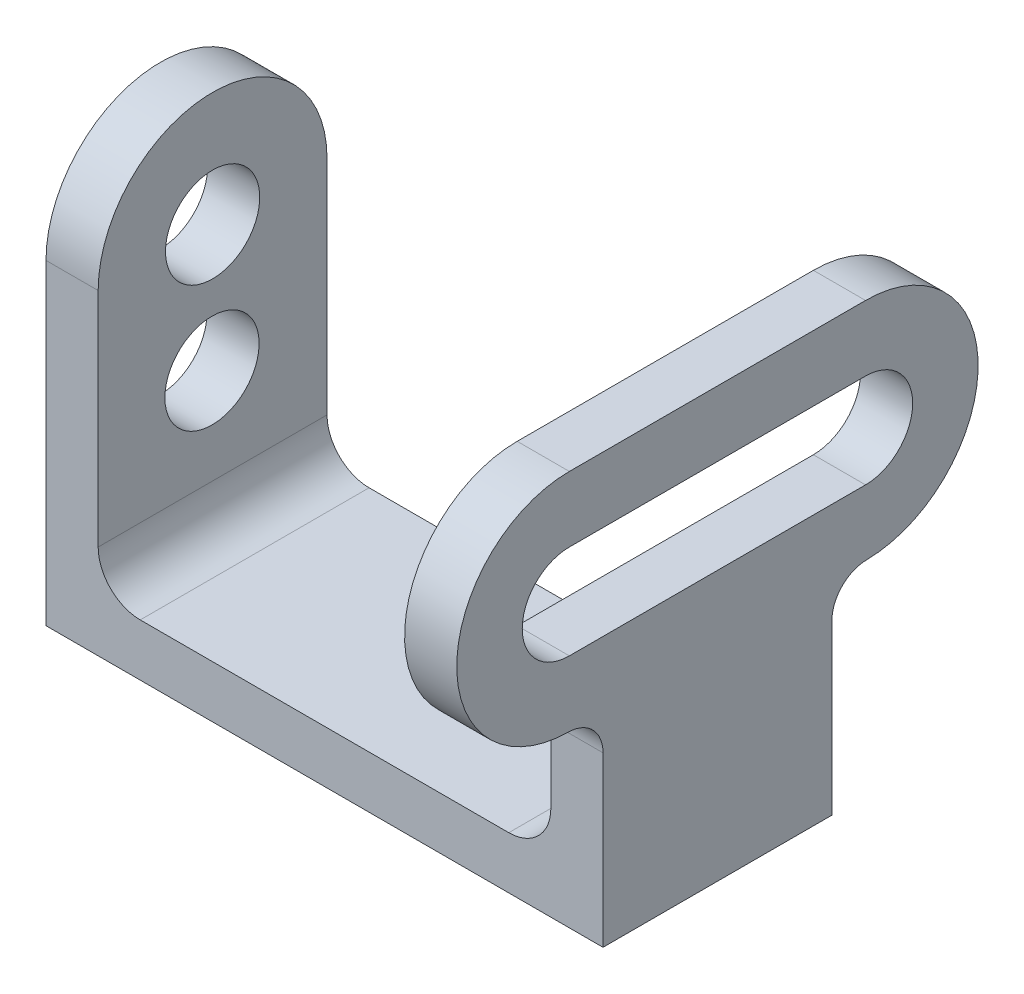
ISO-10303-21;
HEADER;
FILE_DESCRIPTION(('STEP AP214'),'2;1');
FILE_NAME('part.step','',(''),(''),'','','');
FILE_SCHEMA(('AUTOMOTIVE_DESIGN { 1 0 10303 214 1 1 1 1 }'));
ENDSEC;
DATA;
#1=APPLICATION_CONTEXT('core data for automotive mechanical design processes');
#2=APPLICATION_PROTOCOL_DEFINITION('international standard','automotive_design',2000,#1);
#3=PRODUCT_CONTEXT('',#1,'mechanical');
#4=PRODUCT('Part','Part','',(#3));
#5=PRODUCT_RELATED_PRODUCT_CATEGORY('part','',(#4));
#6=PRODUCT_DEFINITION_FORMATION('','',#4);
#7=PRODUCT_DEFINITION_CONTEXT('part definition',#1,'design');
#8=PRODUCT_DEFINITION('design','',#6,#7);
#9=PRODUCT_DEFINITION_SHAPE('','',#8);
#10=(LENGTH_UNIT() NAMED_UNIT(*) SI_UNIT(.MILLI.,.METRE.));
#11=(NAMED_UNIT(*) PLANE_ANGLE_UNIT() SI_UNIT($,.RADIAN.));
#12=(NAMED_UNIT(*) SI_UNIT($,.STERADIAN.) SOLID_ANGLE_UNIT());
#13=UNCERTAINTY_MEASURE_WITH_UNIT(LENGTH_MEASURE(1.E-05),#10,'distance_accuracy_value','');
#14=(GEOMETRIC_REPRESENTATION_CONTEXT(3) GLOBAL_UNCERTAINTY_ASSIGNED_CONTEXT((#13)) GLOBAL_UNIT_ASSIGNED_CONTEXT((#10,
#11,#12)) REPRESENTATION_CONTEXT('',''));
#15=CARTESIAN_POINT('',(0.,0.,0.));
#16=DIRECTION('',(0.,0.,1.));
#17=DIRECTION('',(1.,0.,0.));
#18=AXIS2_PLACEMENT_3D('',#15,#16,#17);
#19=CARTESIAN_POINT('',(0.,0.,-34.544));
#20=DIRECTION('',(0.,0.,-1.));
#21=DIRECTION('',(-1.,0.,0.));
#22=AXIS2_PLACEMENT_3D('',#19,#20,#21);
#23=PLANE('',#22);
#24=DIRECTION('',(0.,-1.,0.));
#25=VECTOR('',#24,1.);
#26=CARTESIAN_POINT('',(9.97764102564103,-5.94840199309171,-34.544));
#27=LINE('',#26,#25);
#28=CARTESIAN_POINT('',(9.97764102564103,11.6023960478304,-34.544));
#29=VERTEX_POINT('',#28);
#30=CARTESIAN_POINT('',(9.97764102564103,0.401598006908288,-34.544));
#31=VERTEX_POINT('',#30);
#32=EDGE_CURVE('E255',#29,#31,#27,.T.);
#33=ORIENTED_EDGE('',*,*,#32,.F.);
#34=DIRECTION('',(1.,0.,0.));
#35=VECTOR('',#34,1.);
#36=CARTESIAN_POINT('',(-77.9930484507027,11.6023960478304,-34.544));
#37=LINE('',#36,#35);
#38=CARTESIAN_POINT('',(17.851641025641,11.6023960478304,-34.544));
#39=VERTEX_POINT('',#38);
#40=EDGE_CURVE('E223',#29,#39,#37,.T.);
#41=ORIENTED_EDGE('',*,*,#40,.T.);
#42=DIRECTION('',(0.,1.,0.));
#43=VECTOR('',#42,1.);
#44=CARTESIAN_POINT('',(17.851641025641,33.9295980069083,-34.544));
#45=LINE('',#44,#43);
#46=CARTESIAN_POINT('',(17.851641025641,-13.8224019930917,-34.544));
#47=VERTEX_POINT('',#46);
#48=EDGE_CURVE('E252',#47,#39,#45,.T.);
#49=ORIENTED_EDGE('',*,*,#48,.F.);
#50=DIRECTION('',(1.,0.,0.));
#51=VECTOR('',#50,1.);
#52=CARTESIAN_POINT('',(17.851641025641,-13.8224019930917,-34.544));
#53=LINE('',#52,#51);
#54=CARTESIAN_POINT('',(-66.222358974359,-13.8224019930917,-34.544));
#55=VERTEX_POINT('',#54);
#56=EDGE_CURVE('E248',#55,#47,#53,.T.);
#57=ORIENTED_EDGE('',*,*,#56,.F.);
#58=DIRECTION('',(0.,-1.,0.));
#59=VECTOR('',#58,1.);
#60=CARTESIAN_POINT('',(-66.222358974359,-13.8224019930917,-34.544));
#61=LINE('',#60,#59);
#62=CARTESIAN_POINT('',(-66.222358974359,33.9295980069083,-34.544));
#63=VERTEX_POINT('',#62);
#64=EDGE_CURVE('E245',#63,#55,#61,.T.);
#65=ORIENTED_EDGE('',*,*,#64,.F.);
#66=DIRECTION('',(-1.,0.,0.));
#67=VECTOR('',#66,1.);
#68=CARTESIAN_POINT('',(-66.222358974359,33.9295980069083,-34.544));
#69=LINE('',#68,#67);
#70=CARTESIAN_POINT('',(-58.348358974359,33.9295980069083,-34.544));
#71=VERTEX_POINT('',#70);
#72=EDGE_CURVE('E263',#71,#63,#69,.T.);
#73=ORIENTED_EDGE('',*,*,#72,.F.);
#74=DIRECTION('',(0.,1.,0.));
#75=VECTOR('',#74,1.);
#76=CARTESIAN_POINT('',(-58.348358974359,33.9295980069083,-34.544));
#77=LINE('',#76,#75);
#78=CARTESIAN_POINT('',(-58.348358974359,0.401598006908289,-34.544));
#79=VERTEX_POINT('',#78);
#80=EDGE_CURVE('E261',#79,#71,#77,.T.);
#81=ORIENTED_EDGE('',*,*,#80,.F.);
#82=CARTESIAN_POINT('',(-51.998358974359,0.401598006908288,-34.544));
#83=DIRECTION('',(0.,0.,-1.));
#84=DIRECTION('',(-1.,0.,0.));
#85=AXIS2_PLACEMENT_3D('',#82,#83,#84);
#86=CIRCLE('',#85,6.35);
#87=CARTESIAN_POINT('',(-51.998358974359,-5.94840199309171,-34.544));
#88=VERTEX_POINT('',#87);
#89=EDGE_CURVE('E11',#79,#88,#86,.F.);
#90=ORIENTED_EDGE('',*,*,#89,.T.);
#91=DIRECTION('',(-1.,0.,0.));
#92=VECTOR('',#91,1.);
#93=CARTESIAN_POINT('',(-58.348358974359,-5.94840199309171,-34.544));
#94=LINE('',#93,#92);
#95=CARTESIAN_POINT('',(3.62764102564102,-5.94840199309171,-34.544));
#96=VERTEX_POINT('',#95);
#97=EDGE_CURVE('E258',#96,#88,#94,.T.);
#98=ORIENTED_EDGE('',*,*,#97,.F.);
#99=CARTESIAN_POINT('',(3.62764102564103,0.401598006908288,-34.544));
#100=DIRECTION('',(0.,0.,-1.));
#101=DIRECTION('',(-1.,0.,0.));
#102=AXIS2_PLACEMENT_3D('',#99,#100,#101);
#103=CIRCLE('',#102,6.35);
#104=EDGE_CURVE('E296',#96,#31,#103,.F.);
#105=ORIENTED_EDGE('',*,*,#104,.T.);
#106=EDGE_LOOP('',(#33,#41,#49,#57,#65,#73,#81,#90,#98,#105));
#107=FACE_BOUND('',#106,.T.);
#108=ADVANCED_FACE('F35',(#107),#23,.T.);
#109=CARTESIAN_POINT('',(0.,0.,0.));
#110=DIRECTION('',(0.,0.,-1.));
#111=DIRECTION('',(-1.,0.,0.));
#112=AXIS2_PLACEMENT_3D('',#109,#110,#111);
#113=PLANE('',#112);
#114=DIRECTION('',(1.,0.,0.));
#115=VECTOR('',#114,1.);
#116=CARTESIAN_POINT('',(-77.9930484507027,11.6023960478304,0.));
#117=LINE('',#116,#115);
#118=CARTESIAN_POINT('',(9.97764102564103,11.6023960478304,0.));
#119=VERTEX_POINT('',#118);
#120=CARTESIAN_POINT('',(17.851641025641,11.6023960478304,0.));
#121=VERTEX_POINT('',#120);
#122=EDGE_CURVE('E213',#119,#121,#117,.T.);
#123=ORIENTED_EDGE('',*,*,#122,.F.);
#124=DIRECTION('',(0.,-1.,0.));
#125=VECTOR('',#124,1.);
#126=CARTESIAN_POINT('',(9.97764102564103,-5.94840199309171,0.));
#127=LINE('',#126,#125);
#128=CARTESIAN_POINT('',(9.97764102564103,0.401598006908288,0.));
#129=VERTEX_POINT('',#128);
#130=EDGE_CURVE('E273',#119,#129,#127,.T.);
#131=ORIENTED_EDGE('',*,*,#130,.T.);
#132=CARTESIAN_POINT('',(3.62764102564103,0.401598006908288,0.));
#133=DIRECTION('',(0.,0.,-1.));
#134=DIRECTION('',(-1.,0.,0.));
#135=AXIS2_PLACEMENT_3D('',#132,#133,#134);
#136=CIRCLE('',#135,6.35);
#137=CARTESIAN_POINT('',(3.62764102564102,-5.94840199309171,0.));
#138=VERTEX_POINT('',#137);
#139=EDGE_CURVE('E294',#129,#138,#136,.T.);
#140=ORIENTED_EDGE('',*,*,#139,.T.);
#141=DIRECTION('',(-1.,0.,0.));
#142=VECTOR('',#141,1.);
#143=CARTESIAN_POINT('',(-58.348358974359,-5.94840199309171,0.));
#144=LINE('',#143,#142);
#145=CARTESIAN_POINT('',(-51.998358974359,-5.94840199309171,0.));
#146=VERTEX_POINT('',#145);
#147=EDGE_CURVE('E276',#138,#146,#144,.T.);
#148=ORIENTED_EDGE('',*,*,#147,.T.);
#149=CARTESIAN_POINT('',(-51.998358974359,0.401598006908288,0.));
#150=DIRECTION('',(0.,0.,-1.));
#151=DIRECTION('',(-1.,0.,0.));
#152=AXIS2_PLACEMENT_3D('',#149,#150,#151);
#153=CIRCLE('',#152,6.35);
#154=CARTESIAN_POINT('',(-58.348358974359,0.401598006908289,0.));
#155=VERTEX_POINT('',#154);
#156=EDGE_CURVE('E43',#146,#155,#153,.T.);
#157=ORIENTED_EDGE('',*,*,#156,.T.);
#158=DIRECTION('',(0.,1.,0.));
#159=VECTOR('',#158,1.);
#160=CARTESIAN_POINT('',(-58.348358974359,33.9295980069083,0.));
#161=LINE('',#160,#159);
#162=CARTESIAN_POINT('',(-58.348358974359,33.9295980069083,0.));
#163=VERTEX_POINT('',#162);
#164=EDGE_CURVE('E278',#155,#163,#161,.T.);
#165=ORIENTED_EDGE('',*,*,#164,.T.);
#166=DIRECTION('',(-1.,0.,0.));
#167=VECTOR('',#166,1.);
#168=CARTESIAN_POINT('',(-66.222358974359,33.9295980069083,0.));
#169=LINE('',#168,#167);
#170=CARTESIAN_POINT('',(-66.222358974359,33.9295980069083,0.));
#171=VERTEX_POINT('',#170);
#172=EDGE_CURVE('E249',#163,#171,#169,.T.);
#173=ORIENTED_EDGE('',*,*,#172,.T.);
#174=DIRECTION('',(0.,-1.,0.));
#175=VECTOR('',#174,1.);
#176=CARTESIAN_POINT('',(-66.222358974359,-13.8224019930917,0.));
#177=LINE('',#176,#175);
#178=CARTESIAN_POINT('',(-66.222358974359,-13.8224019930917,0.));
#179=VERTEX_POINT('',#178);
#180=EDGE_CURVE('E240',#171,#179,#177,.T.);
#181=ORIENTED_EDGE('',*,*,#180,.T.);
#182=DIRECTION('',(1.,0.,0.));
#183=VECTOR('',#182,1.);
#184=CARTESIAN_POINT('',(17.851641025641,-13.8224019930917,0.));
#185=LINE('',#184,#183);
#186=CARTESIAN_POINT('',(17.851641025641,-13.8224019930917,0.));
#187=VERTEX_POINT('',#186);
#188=EDGE_CURVE('E268',#179,#187,#185,.T.);
#189=ORIENTED_EDGE('',*,*,#188,.T.);
#190=DIRECTION('',(0.,1.,0.));
#191=VECTOR('',#190,1.);
#192=CARTESIAN_POINT('',(17.851641025641,33.9295980069083,0.));
#193=LINE('',#192,#191);
#194=EDGE_CURVE('E271',#187,#121,#193,.T.);
#195=ORIENTED_EDGE('',*,*,#194,.T.);
#196=EDGE_LOOP('',(#123,#131,#140,#148,#157,#165,#173,#181,#189,#195));
#197=FACE_BOUND('',#196,.T.);
#198=ADVANCED_FACE('F309',(#197),#113,.F.);
#199=CARTESIAN_POINT('',(-66.222358974359,-13.8224019930917,-34.544));
#200=DIRECTION('',(-1.,0.,0.));
#201=DIRECTION('',(0.,0.,1.));
#202=AXIS2_PLACEMENT_3D('',#199,#200,#201);
#203=PLANE('',#202);
#204=CARTESIAN_POINT('',(-66.222358974359,33.9295980069083,-17.272));
#205=DIRECTION('',(-1.,0.,0.));
#206=DIRECTION('',(0.,0.,1.));
#207=AXIS2_PLACEMENT_3D('',#204,#205,#206);
#208=CIRCLE('',#207,7.112);
#209=CARTESIAN_POINT('',(-66.222358974359,33.9295980069083,-10.16));
#210=VERTEX_POINT('',#209);
#211=EDGE_CURVE('E233',#210,#210,#208,.T.);
#212=ORIENTED_EDGE('',*,*,#211,.F.);
#213=EDGE_LOOP('',(#212));
#214=FACE_BOUND('',#213,.T.);
#215=CARTESIAN_POINT('',(-66.222358974359,33.9295980069083,-17.272));
#216=DIRECTION('',(-1.,0.,0.));
#217=DIRECTION('',(0.,0.,1.));
#218=AXIS2_PLACEMENT_3D('',#215,#216,#217);
#219=CIRCLE('',#218,17.272);
#220=EDGE_CURVE('E188',#171,#63,#219,.T.);
#221=ORIENTED_EDGE('',*,*,#220,.T.);
#222=ORIENTED_EDGE('',*,*,#64,.T.);
#223=DIRECTION('',(0.,0.,1.));
#224=VECTOR('',#223,1.);
#225=CARTESIAN_POINT('',(-66.222358974359,-13.8224019930917,-34.544));
#226=LINE('',#225,#224);
#227=EDGE_CURVE('E265',#55,#179,#226,.T.);
#228=ORIENTED_EDGE('',*,*,#227,.T.);
#229=ORIENTED_EDGE('',*,*,#180,.F.);
#230=EDGE_LOOP('',(#221,#222,#228,#229));
#231=FACE_BOUND('',#230,.T.);
#232=CARTESIAN_POINT('',(-66.222358974359,14.8795980069083,-17.181485908189));
#233=DIRECTION('',(-1.,0.,0.));
#234=DIRECTION('',(0.,0.,1.));
#235=AXIS2_PLACEMENT_3D('',#232,#233,#234);
#236=CIRCLE('',#235,7.112);
#237=CARTESIAN_POINT('',(-66.222358974359,14.8795980069083,-10.069485908189));
#238=VERTEX_POINT('',#237);
#239=EDGE_CURVE('E231',#238,#238,#236,.T.);
#240=ORIENTED_EDGE('',*,*,#239,.F.);
#241=EDGE_LOOP('',(#240));
#242=FACE_BOUND('',#241,.T.);
#243=ADVANCED_FACE('F326',(#214,#231,#242),#203,.T.);
#244=CARTESIAN_POINT('',(-58.348358974359,33.9295980069083,-34.544));
#245=DIRECTION('',(1.,0.,0.));
#246=DIRECTION('',(0.,1.,0.));
#247=AXIS2_PLACEMENT_3D('',#244,#245,#246);
#248=PLANE('',#247);
#249=CARTESIAN_POINT('',(-58.348358974359,33.9295980069083,-17.272));
#250=DIRECTION('',(1.,0.,0.));
#251=DIRECTION('',(0.,1.,0.));
#252=AXIS2_PLACEMENT_3D('',#249,#250,#251);
#253=CIRCLE('',#252,7.112);
#254=CARTESIAN_POINT('',(-58.348358974359,41.0415980069083,-17.272));
#255=VERTEX_POINT('',#254);
#256=EDGE_CURVE('E236',#255,#255,#253,.F.);
#257=ORIENTED_EDGE('',*,*,#256,.T.);
#258=EDGE_LOOP('',(#257));
#259=FACE_BOUND('',#258,.T.);
#260=ORIENTED_EDGE('',*,*,#164,.F.);
#261=DIRECTION('',(0.,0.,1.));
#262=VECTOR('',#261,1.);
#263=CARTESIAN_POINT('',(-58.348358974359,0.401598006908287,-34.544));
#264=LINE('',#263,#262);
#265=EDGE_CURVE('E56',#155,#79,#264,.F.);
#266=ORIENTED_EDGE('',*,*,#265,.T.);
#267=ORIENTED_EDGE('',*,*,#80,.T.);
#268=CARTESIAN_POINT('',(-58.348358974359,33.9295980069083,-17.272));
#269=DIRECTION('',(1.,0.,0.));
#270=DIRECTION('',(0.,1.,0.));
#271=AXIS2_PLACEMENT_3D('',#268,#269,#270);
#272=CIRCLE('',#271,17.272);
#273=EDGE_CURVE('E184',#163,#71,#272,.F.);
#274=ORIENTED_EDGE('',*,*,#273,.F.);
#275=EDGE_LOOP('',(#260,#266,#267,#274));
#276=FACE_BOUND('',#275,.T.);
#277=CARTESIAN_POINT('',(-58.348358974359,14.8795980069083,-17.181485908189));
#278=DIRECTION('',(1.,0.,0.));
#279=DIRECTION('',(0.,1.,0.));
#280=AXIS2_PLACEMENT_3D('',#277,#278,#279);
#281=CIRCLE('',#280,7.112);
#282=CARTESIAN_POINT('',(-58.348358974359,21.9915980069083,-17.181485908189));
#283=VERTEX_POINT('',#282);
#284=EDGE_CURVE('E237',#283,#283,#281,.F.);
#285=ORIENTED_EDGE('',*,*,#284,.T.);
#286=EDGE_LOOP('',(#285));
#287=FACE_BOUND('',#286,.T.);
#288=ADVANCED_FACE('F318',(#259,#276,#287),#248,.T.);
#289=CARTESIAN_POINT('',(-58.348358974359,-5.94840199309171,-34.544));
#290=DIRECTION('',(0.,1.,0.));
#291=DIRECTION('',(0.,0.,1.));
#292=AXIS2_PLACEMENT_3D('',#289,#290,#291);
#293=PLANE('',#292);
#294=ORIENTED_EDGE('',*,*,#147,.F.);
#295=DIRECTION('',(0.,0.,1.));
#296=VECTOR('',#295,1.);
#297=CARTESIAN_POINT('',(3.62764102564103,-5.94840199309171,-34.544));
#298=LINE('',#297,#296);
#299=EDGE_CURVE('E291',#138,#96,#298,.F.);
#300=ORIENTED_EDGE('',*,*,#299,.T.);
#301=ORIENTED_EDGE('',*,*,#97,.T.);
#302=DIRECTION('',(0.,0.,1.));
#303=VECTOR('',#302,1.);
#304=CARTESIAN_POINT('',(-51.998358974359,-5.94840199309171,0.));
#305=LINE('',#304,#303);
#306=EDGE_CURVE('E288',#88,#146,#305,.T.);
#307=ORIENTED_EDGE('',*,*,#306,.T.);
#308=EDGE_LOOP('',(#294,#300,#301,#307));
#309=FACE_BOUND('',#308,.T.);
#310=ADVANCED_FACE('F311',(#309),#293,.T.);
#311=CARTESIAN_POINT('',(9.97764102564103,-5.94840199309171,-34.544));
#312=DIRECTION('',(-1.,0.,0.));
#313=DIRECTION('',(0.,0.,1.));
#314=AXIS2_PLACEMENT_3D('',#311,#312,#313);
#315=PLANE('',#314);
#316=DIRECTION('',(0.,0.,-1.));
#317=VECTOR('',#316,1.);
#318=CARTESIAN_POINT('',(9.97764102564103,26.8175980069083,0.));
#319=LINE('',#318,#317);
#320=CARTESIAN_POINT('',(9.97764102564103,26.8175980069083,5.08));
#321=VERTEX_POINT('',#320);
#322=CARTESIAN_POINT('',(9.97764102564103,26.8175980069083,-39.624));
#323=VERTEX_POINT('',#322);
#324=EDGE_CURVE('E171',#321,#323,#319,.T.);
#325=ORIENTED_EDGE('',*,*,#324,.T.);
#326=CARTESIAN_POINT('',(9.97764102564103,33.9295980069083,-39.624));
#327=DIRECTION('',(-1.,0.,0.));
#328=DIRECTION('',(0.,0.,1.));
#329=AXIS2_PLACEMENT_3D('',#326,#327,#328);
#330=CIRCLE('',#329,7.112);
#331=CARTESIAN_POINT('',(9.97764102564103,41.0415980069083,-39.624));
#332=VERTEX_POINT('',#331);
#333=EDGE_CURVE('E185',#323,#332,#330,.F.);
#334=ORIENTED_EDGE('',*,*,#333,.T.);
#335=DIRECTION('',(0.,0.,-1.));
#336=VECTOR('',#335,1.);
#337=CARTESIAN_POINT('',(9.97764102564103,41.0415980069083,0.));
#338=LINE('',#337,#336);
#339=CARTESIAN_POINT('',(9.97764102564103,41.0415980069083,5.08));
#340=VERTEX_POINT('',#339);
#341=EDGE_CURVE('E183',#340,#332,#338,.T.);
#342=ORIENTED_EDGE('',*,*,#341,.F.);
#343=CARTESIAN_POINT('',(9.97764102564103,33.9295980069083,5.08));
#344=DIRECTION('',(-1.,0.,0.));
#345=DIRECTION('',(0.,0.,1.));
#346=AXIS2_PLACEMENT_3D('',#343,#344,#345);
#347=CIRCLE('',#346,7.112);
#348=EDGE_CURVE('E162',#340,#321,#347,.F.);
#349=ORIENTED_EDGE('',*,*,#348,.T.);
#350=EDGE_LOOP('',(#325,#334,#342,#349));
#351=FACE_BOUND('',#350,.T.);
#352=ORIENTED_EDGE('',*,*,#32,.T.);
#353=DIRECTION('',(0.,0.,1.));
#354=VECTOR('',#353,1.);
#355=CARTESIAN_POINT('',(9.97764102564103,0.401598006908288,0.));
#356=LINE('',#355,#354);
#357=EDGE_CURVE('E284',#31,#129,#356,.T.);
#358=ORIENTED_EDGE('',*,*,#357,.T.);
#359=ORIENTED_EDGE('',*,*,#130,.F.);
#360=CARTESIAN_POINT('',(9.97764102564103,11.6023960478304,5.334));
#361=DIRECTION('',(-1.,0.,0.));
#362=DIRECTION('',(0.,0.,1.));
#363=AXIS2_PLACEMENT_3D('',#360,#361,#362);
#364=CIRCLE('',#363,5.334);
#365=CARTESIAN_POINT('',(9.97764102564103,16.9360509202273,5.27332296845472));
#366=VERTEX_POINT('',#365);
#367=EDGE_CURVE('E177',#119,#366,#364,.F.);
#368=ORIENTED_EDGE('',*,*,#367,.T.);
#369=CARTESIAN_POINT('',(9.97764102564103,33.9295980069083,5.08));
#370=DIRECTION('',(-1.,0.,0.));
#371=DIRECTION('',(0.,0.,1.));
#372=AXIS2_PLACEMENT_3D('',#369,#370,#371);
#373=CIRCLE('',#372,16.9946466970448);
#374=CARTESIAN_POINT('',(9.97764102564103,50.9242447039531,5.08));
#375=VERTEX_POINT('',#374);
#376=EDGE_CURVE('E207',#375,#366,#373,.F.);
#377=ORIENTED_EDGE('',*,*,#376,.F.);
#378=DIRECTION('',(0.,0.,-1.));
#379=VECTOR('',#378,1.);
#380=CARTESIAN_POINT('',(9.97764102564103,50.9242447039531,0.));
#381=LINE('',#380,#379);
#382=CARTESIAN_POINT('',(9.97764102564103,50.9242447039531,-39.624));
#383=VERTEX_POINT('',#382);
#384=EDGE_CURVE('E200',#375,#383,#381,.T.);
#385=ORIENTED_EDGE('',*,*,#384,.T.);
#386=CARTESIAN_POINT('',(9.97764102564103,33.9295980069083,-39.624));
#387=DIRECTION('',(-1.,0.,0.));
#388=DIRECTION('',(0.,0.,1.));
#389=AXIS2_PLACEMENT_3D('',#386,#387,#388);
#390=CIRCLE('',#389,16.9946466970448);
#391=CARTESIAN_POINT('',(9.97764102564103,16.9360509202273,-39.8173229684547));
#392=VERTEX_POINT('',#391);
#393=EDGE_CURVE('E201',#392,#383,#390,.F.);
#394=ORIENTED_EDGE('',*,*,#393,.F.);
#395=CARTESIAN_POINT('',(9.97764102564103,11.6023960478304,-39.878));
#396=DIRECTION('',(-1.,0.,0.));
#397=DIRECTION('',(0.,0.,1.));
#398=AXIS2_PLACEMENT_3D('',#395,#396,#397);
#399=CIRCLE('',#398,5.334);
#400=EDGE_CURVE('E190',#392,#29,#399,.F.);
#401=ORIENTED_EDGE('',*,*,#400,.T.);
#402=EDGE_LOOP('',(#352,#358,#359,#368,#377,#385,#394,#401));
#403=FACE_BOUND('',#402,.T.);
#404=ADVANCED_FACE('F181',(#351,#403),#315,.T.);
#405=CARTESIAN_POINT('',(17.851641025641,33.9295980069083,-34.544));
#406=DIRECTION('',(1.,0.,0.));
#407=DIRECTION('',(0.,1.,0.));
#408=AXIS2_PLACEMENT_3D('',#405,#406,#407);
#409=PLANE('',#408);
#410=DIRECTION('',(0.,0.,-1.));
#411=VECTOR('',#410,1.);
#412=CARTESIAN_POINT('',(17.851641025641,26.8175980069083,0.));
#413=LINE('',#412,#411);
#414=CARTESIAN_POINT('',(17.851641025641,26.8175980069083,5.08));
#415=VERTEX_POINT('',#414);
#416=CARTESIAN_POINT('',(17.851641025641,26.8175980069083,-39.624));
#417=VERTEX_POINT('',#416);
#418=EDGE_CURVE('E194',#415,#417,#413,.T.);
#419=ORIENTED_EDGE('',*,*,#418,.F.);
#420=CARTESIAN_POINT('',(17.851641025641,33.9295980069083,5.08));
#421=DIRECTION('',(1.,0.,0.));
#422=DIRECTION('',(0.,1.,0.));
#423=AXIS2_PLACEMENT_3D('',#420,#421,#422);
#424=CIRCLE('',#423,7.112);
#425=CARTESIAN_POINT('',(17.851641025641,41.0415980069083,5.08));
#426=VERTEX_POINT('',#425);
#427=EDGE_CURVE('E165',#426,#415,#424,.T.);
#428=ORIENTED_EDGE('',*,*,#427,.F.);
#429=DIRECTION('',(0.,0.,-1.));
#430=VECTOR('',#429,1.);
#431=CARTESIAN_POINT('',(17.851641025641,41.0415980069083,0.));
#432=LINE('',#431,#430);
#433=CARTESIAN_POINT('',(17.851641025641,41.0415980069083,-39.624));
#434=VERTEX_POINT('',#433);
#435=EDGE_CURVE('E168',#426,#434,#432,.T.);
#436=ORIENTED_EDGE('',*,*,#435,.T.);
#437=CARTESIAN_POINT('',(17.851641025641,33.9295980069083,-39.624));
#438=DIRECTION('',(1.,0.,0.));
#439=DIRECTION('',(0.,1.,0.));
#440=AXIS2_PLACEMENT_3D('',#437,#438,#439);
#441=CIRCLE('',#440,7.112);
#442=EDGE_CURVE('E197',#417,#434,#441,.T.);
#443=ORIENTED_EDGE('',*,*,#442,.F.);
#444=EDGE_LOOP('',(#419,#428,#436,#443));
#445=FACE_BOUND('',#444,.T.);
#446=ORIENTED_EDGE('',*,*,#194,.F.);
#447=DIRECTION('',(0.,0.,1.));
#448=VECTOR('',#447,1.);
#449=CARTESIAN_POINT('',(17.851641025641,-13.8224019930917,-34.544));
#450=LINE('',#449,#448);
#451=EDGE_CURVE('E282',#47,#187,#450,.T.);
#452=ORIENTED_EDGE('',*,*,#451,.F.);
#453=ORIENTED_EDGE('',*,*,#48,.T.);
#454=CARTESIAN_POINT('',(17.851641025641,11.6023960478304,-39.878));
#455=DIRECTION('',(1.,0.,0.));
#456=DIRECTION('',(0.,1.,0.));
#457=AXIS2_PLACEMENT_3D('',#454,#455,#456);
#458=CIRCLE('',#457,5.334);
#459=CARTESIAN_POINT('',(17.851641025641,16.9360509202273,-39.8173229684547));
#460=VERTEX_POINT('',#459);
#461=EDGE_CURVE('E222',#460,#39,#458,.T.);
#462=ORIENTED_EDGE('',*,*,#461,.F.);
#463=CARTESIAN_POINT('',(17.851641025641,33.9295980069083,-39.624));
#464=DIRECTION('',(1.,0.,0.));
#465=DIRECTION('',(0.,1.,0.));
#466=AXIS2_PLACEMENT_3D('',#463,#464,#465);
#467=CIRCLE('',#466,16.9946466970448);
#468=CARTESIAN_POINT('',(17.851641025641,50.9242447039531,-39.624));
#469=VERTEX_POINT('',#468);
#470=EDGE_CURVE('E355',#460,#469,#467,.T.);
#471=ORIENTED_EDGE('',*,*,#470,.T.);
#472=DIRECTION('',(0.,0.,-1.));
#473=VECTOR('',#472,1.);
#474=CARTESIAN_POINT('',(17.851641025641,50.9242447039531,0.));
#475=LINE('',#474,#473);
#476=CARTESIAN_POINT('',(17.851641025641,50.9242447039531,5.08));
#477=VERTEX_POINT('',#476);
#478=EDGE_CURVE('E204',#477,#469,#475,.T.);
#479=ORIENTED_EDGE('',*,*,#478,.F.);
#480=CARTESIAN_POINT('',(17.851641025641,33.9295980069083,5.08));
#481=DIRECTION('',(1.,0.,0.));
#482=DIRECTION('',(0.,1.,0.));
#483=AXIS2_PLACEMENT_3D('',#480,#481,#482);
#484=CIRCLE('',#483,16.9946466970448);
#485=CARTESIAN_POINT('',(17.851641025641,16.9360509202273,5.27332296845472));
#486=VERTEX_POINT('',#485);
#487=EDGE_CURVE('E178',#477,#486,#484,.T.);
#488=ORIENTED_EDGE('',*,*,#487,.T.);
#489=CARTESIAN_POINT('',(17.851641025641,11.6023960478304,5.334));
#490=DIRECTION('',(1.,0.,0.));
#491=DIRECTION('',(0.,1.,0.));
#492=AXIS2_PLACEMENT_3D('',#489,#490,#491);
#493=CIRCLE('',#492,5.334);
#494=EDGE_CURVE('E210',#121,#486,#493,.T.);
#495=ORIENTED_EDGE('',*,*,#494,.F.);
#496=EDGE_LOOP('',(#446,#452,#453,#462,#471,#479,#488,#495));
#497=FACE_BOUND('',#496,.T.);
#498=ADVANCED_FACE('F335',(#445,#497),#409,.T.);
#499=CARTESIAN_POINT('',(17.851641025641,-13.8224019930917,-34.544));
#500=DIRECTION('',(0.,-1.,0.));
#501=DIRECTION('',(1.,0.,0.));
#502=AXIS2_PLACEMENT_3D('',#499,#500,#501);
#503=PLANE('',#502);
#504=ORIENTED_EDGE('',*,*,#188,.F.);
#505=ORIENTED_EDGE('',*,*,#227,.F.);
#506=ORIENTED_EDGE('',*,*,#56,.T.);
#507=ORIENTED_EDGE('',*,*,#451,.T.);
#508=EDGE_LOOP('',(#504,#505,#506,#507));
#509=FACE_BOUND('',#508,.T.);
#510=ADVANCED_FACE('F330',(#509),#503,.T.);
#511=CARTESIAN_POINT('',(-38.2325852631641,14.8795980069083,-17.181485908189));
#512=DIRECTION('',(-1.,0.,0.));
#513=DIRECTION('',(0.,0.,1.));
#514=AXIS2_PLACEMENT_3D('',#511,#512,#513);
#515=CYLINDRICAL_SURFACE('',#514,7.112);
#516=ORIENTED_EDGE('',*,*,#239,.T.);
#517=EDGE_LOOP('',(#516));
#518=FACE_BOUND('',#517,.T.);
#519=ORIENTED_EDGE('',*,*,#284,.F.);
#520=EDGE_LOOP('',(#519));
#521=FACE_BOUND('',#520,.T.);
#522=ADVANCED_FACE('F390',(#518,#521),#515,.F.);
#523=CARTESIAN_POINT('',(-38.2325852631641,33.9295980069083,-17.272));
#524=DIRECTION('',(-1.,0.,0.));
#525=DIRECTION('',(0.,0.,1.));
#526=AXIS2_PLACEMENT_3D('',#523,#524,#525);
#527=CYLINDRICAL_SURFACE('',#526,7.112);
#528=ORIENTED_EDGE('',*,*,#211,.T.);
#529=EDGE_LOOP('',(#528));
#530=FACE_BOUND('',#529,.T.);
#531=ORIENTED_EDGE('',*,*,#256,.F.);
#532=EDGE_LOOP('',(#531));
#533=FACE_BOUND('',#532,.T.);
#534=ADVANCED_FACE('F476',(#530,#533),#527,.F.);
#535=CARTESIAN_POINT('',(-19.7269928669826,33.9295980069083,-17.272));
#536=DIRECTION('',(-1.,0.,0.));
#537=DIRECTION('',(0.,0.,1.));
#538=AXIS2_PLACEMENT_3D('',#535,#536,#537);
#539=CYLINDRICAL_SURFACE('',#538,17.272);
#540=ORIENTED_EDGE('',*,*,#172,.F.);
#541=ORIENTED_EDGE('',*,*,#273,.T.);
#542=ORIENTED_EDGE('',*,*,#72,.T.);
#543=ORIENTED_EDGE('',*,*,#220,.F.);
#544=EDGE_LOOP('',(#540,#541,#542,#543));
#545=FACE_BOUND('',#544,.T.);
#546=ADVANCED_FACE('F322',(#545),#539,.T.);
#547=CARTESIAN_POINT('',(-77.9930484507027,11.6023960478304,5.334));
#548=DIRECTION('',(1.,0.,0.));
#549=DIRECTION('',(0.,1.,0.));
#550=AXIS2_PLACEMENT_3D('',#547,#548,#549);
#551=CYLINDRICAL_SURFACE('',#550,5.334);
#552=ORIENTED_EDGE('',*,*,#367,.F.);
#553=ORIENTED_EDGE('',*,*,#122,.T.);
#554=ORIENTED_EDGE('',*,*,#494,.T.);
#555=DIRECTION('',(1.,0.,0.));
#556=VECTOR('',#555,1.);
#557=CARTESIAN_POINT('',(-77.9930484507027,16.9360509202272,5.27332296845472));
#558=LINE('',#557,#556);
#559=EDGE_CURVE('E209',#366,#486,#558,.T.);
#560=ORIENTED_EDGE('',*,*,#559,.F.);
#561=EDGE_LOOP('',(#552,#553,#554,#560));
#562=FACE_BOUND('',#561,.T.);
#563=ADVANCED_FACE('F340',(#562),#551,.F.);
#564=CARTESIAN_POINT('',(-77.9930484507027,33.9295980069083,5.08));
#565=DIRECTION('',(1.,0.,0.));
#566=DIRECTION('',(0.,1.,0.));
#567=AXIS2_PLACEMENT_3D('',#564,#565,#566);
#568=CYLINDRICAL_SURFACE('',#567,16.9946466970448);
#569=DIRECTION('',(1.,0.,0.));
#570=VECTOR('',#569,1.);
#571=CARTESIAN_POINT('',(-77.9930484507027,50.9242447039531,5.08));
#572=LINE('',#571,#570);
#573=EDGE_CURVE('E217',#375,#477,#572,.T.);
#574=ORIENTED_EDGE('',*,*,#573,.F.);
#575=ORIENTED_EDGE('',*,*,#376,.T.);
#576=ORIENTED_EDGE('',*,*,#559,.T.);
#577=ORIENTED_EDGE('',*,*,#487,.F.);
#578=EDGE_LOOP('',(#574,#575,#576,#577));
#579=FACE_BOUND('',#578,.T.);
#580=ADVANCED_FACE('F345',(#579),#568,.T.);
#581=CARTESIAN_POINT('',(-77.9930484507027,50.9242447039531,0.));
#582=DIRECTION('',(0.,-1.,0.));
#583=DIRECTION('',(0.,0.,-1.));
#584=AXIS2_PLACEMENT_3D('',#581,#582,#583);
#585=PLANE('',#584);
#586=ORIENTED_EDGE('',*,*,#384,.F.);
#587=ORIENTED_EDGE('',*,*,#573,.T.);
#588=ORIENTED_EDGE('',*,*,#478,.T.);
#589=DIRECTION('',(1.,0.,0.));
#590=VECTOR('',#589,1.);
#591=CARTESIAN_POINT('',(-77.9930484507027,50.9242447039531,-39.624));
#592=LINE('',#591,#590);
#593=EDGE_CURVE('E203',#383,#469,#592,.T.);
#594=ORIENTED_EDGE('',*,*,#593,.F.);
#595=EDGE_LOOP('',(#586,#587,#588,#594));
#596=FACE_BOUND('',#595,.T.);
#597=ADVANCED_FACE('F350',(#596),#585,.F.);
#598=CARTESIAN_POINT('',(-77.9930484507027,33.9295980069083,-39.624));
#599=DIRECTION('',(1.,0.,0.));
#600=DIRECTION('',(0.,1.,0.));
#601=AXIS2_PLACEMENT_3D('',#598,#599,#600);
#602=CYLINDRICAL_SURFACE('',#601,16.9946466970448);
#603=DIRECTION('',(1.,0.,0.));
#604=VECTOR('',#603,1.);
#605=CARTESIAN_POINT('',(-77.9930484507027,16.9360509202273,-39.8173229684547));
#606=LINE('',#605,#604);
#607=EDGE_CURVE('E220',#392,#460,#606,.T.);
#608=ORIENTED_EDGE('',*,*,#607,.F.);
#609=ORIENTED_EDGE('',*,*,#393,.T.);
#610=ORIENTED_EDGE('',*,*,#593,.T.);
#611=ORIENTED_EDGE('',*,*,#470,.F.);
#612=EDGE_LOOP('',(#608,#609,#610,#611));
#613=FACE_BOUND('',#612,.T.);
#614=ADVANCED_FACE('F433',(#613),#602,.T.);
#615=CARTESIAN_POINT('',(-77.9930484507027,11.6023960478304,-39.878));
#616=DIRECTION('',(1.,0.,0.));
#617=DIRECTION('',(0.,1.,0.));
#618=AXIS2_PLACEMENT_3D('',#615,#616,#617);
#619=CYLINDRICAL_SURFACE('',#618,5.334);
#620=ORIENTED_EDGE('',*,*,#400,.F.);
#621=ORIENTED_EDGE('',*,*,#607,.T.);
#622=ORIENTED_EDGE('',*,*,#461,.T.);
#623=ORIENTED_EDGE('',*,*,#40,.F.);
#624=EDGE_LOOP('',(#620,#621,#622,#623));
#625=FACE_BOUND('',#624,.T.);
#626=ADVANCED_FACE('F380',(#625),#619,.F.);
#627=CARTESIAN_POINT('',(-77.9930484507027,26.8175980069083,0.));
#628=DIRECTION('',(0.,-1.,0.));
#629=DIRECTION('',(0.,0.,-1.));
#630=AXIS2_PLACEMENT_3D('',#627,#628,#629);
#631=PLANE('',#630);
#632=DIRECTION('',(1.,0.,0.));
#633=VECTOR('',#632,1.);
#634=CARTESIAN_POINT('',(-77.9930484507027,26.8175980069083,-39.624));
#635=LINE('',#634,#633);
#636=EDGE_CURVE('E173',#323,#417,#635,.T.);
#637=ORIENTED_EDGE('',*,*,#636,.F.);
#638=ORIENTED_EDGE('',*,*,#324,.F.);
#639=DIRECTION('',(1.,0.,0.));
#640=VECTOR('',#639,1.);
#641=CARTESIAN_POINT('',(-77.9930484507027,26.8175980069083,5.08));
#642=LINE('',#641,#640);
#643=EDGE_CURVE('E158',#321,#415,#642,.T.);
#644=ORIENTED_EDGE('',*,*,#643,.T.);
#645=ORIENTED_EDGE('',*,*,#418,.T.);
#646=EDGE_LOOP('',(#637,#638,#644,#645));
#647=FACE_BOUND('',#646,.T.);
#648=ADVANCED_FACE('F172',(#647),#631,.F.);
#649=CARTESIAN_POINT('',(-77.9930484507027,33.9295980069083,-39.624));
#650=DIRECTION('',(1.,0.,0.));
#651=DIRECTION('',(0.,1.,0.));
#652=AXIS2_PLACEMENT_3D('',#649,#650,#651);
#653=CYLINDRICAL_SURFACE('',#652,7.112);
#654=ORIENTED_EDGE('',*,*,#333,.F.);
#655=ORIENTED_EDGE('',*,*,#636,.T.);
#656=ORIENTED_EDGE('',*,*,#442,.T.);
#657=DIRECTION('',(1.,0.,0.));
#658=VECTOR('',#657,1.);
#659=CARTESIAN_POINT('',(-77.9930484507027,41.0415980069083,-39.624));
#660=LINE('',#659,#658);
#661=EDGE_CURVE('E196',#332,#434,#660,.T.);
#662=ORIENTED_EDGE('',*,*,#661,.F.);
#663=EDGE_LOOP('',(#654,#655,#656,#662));
#664=FACE_BOUND('',#663,.T.);
#665=ADVANCED_FACE('F372',(#664),#653,.F.);
#666=CARTESIAN_POINT('',(-77.9930484507027,41.0415980069083,0.));
#667=DIRECTION('',(0.,-1.,0.));
#668=DIRECTION('',(0.,0.,-1.));
#669=AXIS2_PLACEMENT_3D('',#666,#667,#668);
#670=PLANE('',#669);
#671=DIRECTION('',(1.,0.,0.));
#672=VECTOR('',#671,1.);
#673=CARTESIAN_POINT('',(-77.9930484507027,41.0415980069083,5.08));
#674=LINE('',#673,#672);
#675=EDGE_CURVE('E228',#340,#426,#674,.T.);
#676=ORIENTED_EDGE('',*,*,#675,.F.);
#677=ORIENTED_EDGE('',*,*,#341,.T.);
#678=ORIENTED_EDGE('',*,*,#661,.T.);
#679=ORIENTED_EDGE('',*,*,#435,.F.);
#680=EDGE_LOOP('',(#676,#677,#678,#679));
#681=FACE_BOUND('',#680,.T.);
#682=ADVANCED_FACE('F369',(#681),#670,.T.);
#683=CARTESIAN_POINT('',(-77.9930484507027,33.9295980069083,5.08));
#684=DIRECTION('',(1.,0.,0.));
#685=DIRECTION('',(0.,1.,0.));
#686=AXIS2_PLACEMENT_3D('',#683,#684,#685);
#687=CYLINDRICAL_SURFACE('',#686,7.112);
#688=ORIENTED_EDGE('',*,*,#348,.F.);
#689=ORIENTED_EDGE('',*,*,#675,.T.);
#690=ORIENTED_EDGE('',*,*,#427,.T.);
#691=ORIENTED_EDGE('',*,*,#643,.F.);
#692=EDGE_LOOP('',(#688,#689,#690,#691));
#693=FACE_BOUND('',#692,.T.);
#694=ADVANCED_FACE('F160',(#693),#687,.F.);
#695=CARTESIAN_POINT('',(3.62764102564103,0.401598006908288,-34.544));
#696=DIRECTION('',(0.,0.,-1.));
#697=DIRECTION('',(-1.,0.,0.));
#698=AXIS2_PLACEMENT_3D('',#695,#696,#697);
#699=CYLINDRICAL_SURFACE('',#698,6.35);
#700=ORIENTED_EDGE('',*,*,#104,.F.);
#701=ORIENTED_EDGE('',*,*,#299,.F.);
#702=ORIENTED_EDGE('',*,*,#139,.F.);
#703=ORIENTED_EDGE('',*,*,#357,.F.);
#704=EDGE_LOOP('',(#700,#701,#702,#703));
#705=FACE_BOUND('',#704,.T.);
#706=ADVANCED_FACE('F306',(#705),#699,.F.);
#707=CARTESIAN_POINT('',(-51.998358974359,0.401598006908288,-34.544));
#708=DIRECTION('',(0.,0.,-1.));
#709=DIRECTION('',(-1.,0.,0.));
#710=AXIS2_PLACEMENT_3D('',#707,#708,#709);
#711=CYLINDRICAL_SURFACE('',#710,6.35);
#712=ORIENTED_EDGE('',*,*,#89,.F.);
#713=ORIENTED_EDGE('',*,*,#265,.F.);
#714=ORIENTED_EDGE('',*,*,#156,.F.);
#715=ORIENTED_EDGE('',*,*,#306,.F.);
#716=EDGE_LOOP('',(#712,#713,#714,#715));
#717=FACE_BOUND('',#716,.T.);
#718=ADVANCED_FACE('F37',(#717),#711,.F.);
#719=CLOSED_SHELL('',(#108,#198,#243,#288,#310,#404,#498,#510,#522,#534,#546,#563,#580,#597,
#614,#626,#648,#665,#682,#694,#706,#718));
#720=MANIFOLD_SOLID_BREP('B2',#719);
#721=ADVANCED_BREP_SHAPE_REPRESENTATION('',(#18,#720),#14);
#722=SHAPE_DEFINITION_REPRESENTATION(#9,#721);
ENDSEC;
END-ISO-10303-21;
